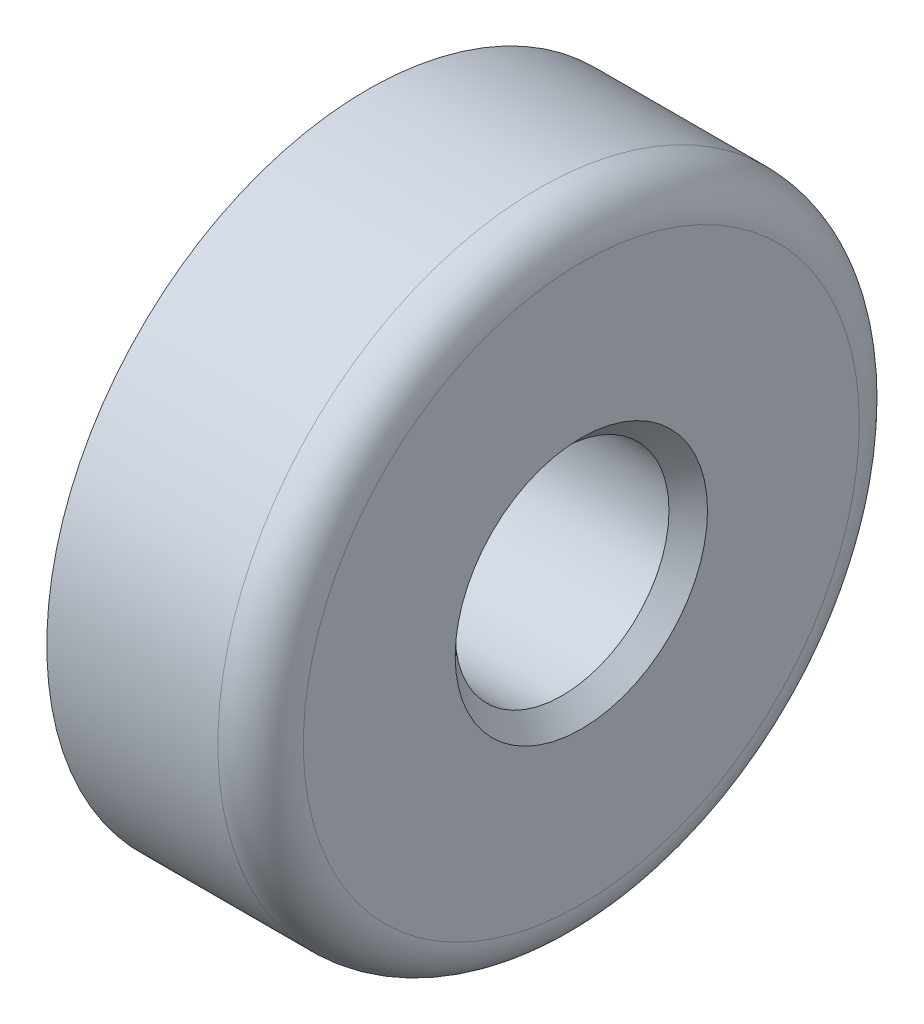
ISO-10303-21;
HEADER;
FILE_DESCRIPTION(('STEP AP214'),'2;1');
FILE_NAME('part.step','',(''),(''),'','','');
FILE_SCHEMA(('AUTOMOTIVE_DESIGN { 1 0 10303 214 1 1 1 1 }'));
ENDSEC;
DATA;
#1=APPLICATION_CONTEXT('core data for automotive mechanical design processes');
#2=APPLICATION_PROTOCOL_DEFINITION('international standard','automotive_design',2000,#1);
#3=PRODUCT_CONTEXT('',#1,'mechanical');
#4=PRODUCT('Part','Part','',(#3));
#5=PRODUCT_RELATED_PRODUCT_CATEGORY('part','',(#4));
#6=PRODUCT_DEFINITION_FORMATION('','',#4);
#7=PRODUCT_DEFINITION_CONTEXT('part definition',#1,'design');
#8=PRODUCT_DEFINITION('design','',#6,#7);
#9=PRODUCT_DEFINITION_SHAPE('','',#8);
#10=(LENGTH_UNIT() NAMED_UNIT(*) SI_UNIT(.MILLI.,.METRE.));
#11=(NAMED_UNIT(*) PLANE_ANGLE_UNIT() SI_UNIT($,.RADIAN.));
#12=(NAMED_UNIT(*) SI_UNIT($,.STERADIAN.) SOLID_ANGLE_UNIT());
#13=UNCERTAINTY_MEASURE_WITH_UNIT(LENGTH_MEASURE(1.E-05),#10,'distance_accuracy_value','');
#14=(GEOMETRIC_REPRESENTATION_CONTEXT(3) GLOBAL_UNCERTAINTY_ASSIGNED_CONTEXT((#13)) GLOBAL_UNIT_ASSIGNED_CONTEXT((#10,
#11,#12)) REPRESENTATION_CONTEXT('',''));
#15=CARTESIAN_POINT('',(0.,0.,0.));
#16=DIRECTION('',(0.,0.,1.));
#17=DIRECTION('',(1.,0.,0.));
#18=AXIS2_PLACEMENT_3D('',#15,#16,#17);
#19=CARTESIAN_POINT('',(5.5,52.5596707782031,134.804015254503));
#20=DIRECTION('',(-1.,0.,0.));
#21=DIRECTION('',(0.,0.,1.));
#22=AXIS2_PLACEMENT_3D('',#19,#20,#21);
#23=CYLINDRICAL_SURFACE('',#22,3.75000000000033);
#24=CARTESIAN_POINT('',(5.,52.5596707782031,134.804015254503));
#25=DIRECTION('',(1.,0.,0.));
#26=DIRECTION('',(0.,0.,-1.));
#27=AXIS2_PLACEMENT_3D('',#24,#25,#26);
#28=CIRCLE('',#27,3.75000000000033);
#29=CARTESIAN_POINT('',(5.,52.5596707782031,131.054015254503));
#30=VERTEX_POINT('',#29);
#31=EDGE_CURVE('E10',#30,#30,#28,.F.);
#32=ORIENTED_EDGE('',*,*,#31,.T.);
#33=EDGE_LOOP('',(#32));
#34=FACE_BOUND('',#33,.T.);
#35=CARTESIAN_POINT('',(3.,52.5596707782031,134.804015254503));
#36=DIRECTION('',(1.,0.,0.));
#37=DIRECTION('',(0.,0.,-1.));
#38=AXIS2_PLACEMENT_3D('',#35,#36,#37);
#39=CIRCLE('',#38,3.75000000000033);
#40=CARTESIAN_POINT('',(3.,52.5596707782031,131.054015254503));
#41=VERTEX_POINT('',#40);
#42=EDGE_CURVE('E59',#41,#41,#39,.T.);
#43=ORIENTED_EDGE('',*,*,#42,.T.);
#44=EDGE_LOOP('',(#43));
#45=FACE_BOUND('',#44,.T.);
#46=ADVANCED_FACE('F33',(#34,#45),#23,.T.);
#47=CARTESIAN_POINT('',(5.5,52.5596707782031,134.804015254503));
#48=DIRECTION('',(1.,0.,0.));
#49=DIRECTION('',(0.,0.,-1.));
#50=AXIS2_PLACEMENT_3D('',#47,#48,#49);
#51=PLANE('',#50);
#52=CARTESIAN_POINT('',(5.5,52.5596707782031,134.804015254503));
#53=DIRECTION('',(1.,0.,0.));
#54=DIRECTION('',(0.,0.,-1.));
#55=AXIS2_PLACEMENT_3D('',#52,#53,#54);
#56=CIRCLE('',#55,3.25000000000033);
#57=CARTESIAN_POINT('',(5.5,52.5596707782031,131.554015254503));
#58=VERTEX_POINT('',#57);
#59=EDGE_CURVE('E40',#58,#58,#56,.T.);
#60=ORIENTED_EDGE('',*,*,#59,.T.);
#61=EDGE_LOOP('',(#60));
#62=FACE_BOUND('',#61,.T.);
#63=CARTESIAN_POINT('',(5.5,52.5596707782031,134.804015254503));
#64=DIRECTION('',(1.,0.,0.));
#65=DIRECTION('',(0.,0.,-1.));
#66=AXIS2_PLACEMENT_3D('',#63,#64,#65);
#67=CIRCLE('',#66,1.475);
#68=CARTESIAN_POINT('',(5.5,52.5596707782031,133.329015254503));
#69=VERTEX_POINT('',#68);
#70=EDGE_CURVE('E56',#69,#69,#67,.F.);
#71=ORIENTED_EDGE('',*,*,#70,.T.);
#72=EDGE_LOOP('',(#71));
#73=FACE_BOUND('',#72,.T.);
#74=ADVANCED_FACE('F67',(#62,#73),#51,.T.);
#75=CARTESIAN_POINT('',(3.,52.5596707782031,134.804015254503));
#76=DIRECTION('',(1.,0.,0.));
#77=DIRECTION('',(0.,0.,-1.));
#78=AXIS2_PLACEMENT_3D('',#75,#76,#77);
#79=PLANE('',#78);
#80=CARTESIAN_POINT('',(3.,52.5596707782031,134.804015254503));
#81=DIRECTION('',(1.,0.,0.));
#82=DIRECTION('',(0.,0.,-1.));
#83=AXIS2_PLACEMENT_3D('',#80,#81,#82);
#84=CIRCLE('',#83,1.47499999999995);
#85=CARTESIAN_POINT('',(3.,52.5596707782031,133.329015254503));
#86=VERTEX_POINT('',#85);
#87=EDGE_CURVE('E44',#86,#86,#84,.T.);
#88=ORIENTED_EDGE('',*,*,#87,.T.);
#89=EDGE_LOOP('',(#88));
#90=FACE_BOUND('',#89,.T.);
#91=ORIENTED_EDGE('',*,*,#42,.F.);
#92=EDGE_LOOP('',(#91));
#93=FACE_BOUND('',#92,.T.);
#94=ADVANCED_FACE('F64',(#90,#93),#79,.F.);
#95=CARTESIAN_POINT('',(3.,52.5596707782031,134.804015254503));
#96=DIRECTION('',(-1.,0.,0.));
#97=DIRECTION('',(0.,0.,1.));
#98=AXIS2_PLACEMENT_3D('',#95,#96,#97);
#99=CYLINDRICAL_SURFACE('',#98,1.24999999999999);
#100=CARTESIAN_POINT('',(5.27499999999999,52.5596707782031,134.804015254503));
#101=DIRECTION('',(1.,0.,0.));
#102=DIRECTION('',(0.,0.,-1.));
#103=AXIS2_PLACEMENT_3D('',#100,#101,#102);
#104=CIRCLE('',#103,1.24999999999999);
#105=CARTESIAN_POINT('',(5.27499999999999,52.5596707782031,133.554015254503));
#106=VERTEX_POINT('',#105);
#107=EDGE_CURVE('E48',#106,#106,#104,.T.);
#108=ORIENTED_EDGE('',*,*,#107,.T.);
#109=EDGE_LOOP('',(#108));
#110=FACE_BOUND('',#109,.T.);
#111=CARTESIAN_POINT('',(3.22499999999997,52.5596707782031,134.804015254503));
#112=DIRECTION('',(1.,0.,0.));
#113=DIRECTION('',(0.,0.,-1.));
#114=AXIS2_PLACEMENT_3D('',#111,#112,#113);
#115=CIRCLE('',#114,1.24999999999999);
#116=CARTESIAN_POINT('',(3.22499999999997,52.5596707782031,133.554015254503));
#117=VERTEX_POINT('',#116);
#118=EDGE_CURVE('E53',#117,#117,#115,.F.);
#119=ORIENTED_EDGE('',*,*,#118,.T.);
#120=EDGE_LOOP('',(#119));
#121=FACE_BOUND('',#120,.T.);
#122=ADVANCED_FACE('F66',(#110,#121),#99,.F.);
#123=CARTESIAN_POINT('',(5.5,52.5596707782031,134.804015254503));
#124=DIRECTION('',(1.,0.,0.));
#125=DIRECTION('',(0.,0.,-1.));
#126=AXIS2_PLACEMENT_3D('',#123,#124,#125);
#127=CONICAL_SURFACE('',#126,1.475,0.785398163397439);
#128=ORIENTED_EDGE('',*,*,#107,.F.);
#129=EDGE_LOOP('',(#128));
#130=FACE_BOUND('',#129,.T.);
#131=ORIENTED_EDGE('',*,*,#70,.F.);
#132=EDGE_LOOP('',(#131));
#133=FACE_BOUND('',#132,.T.);
#134=ADVANCED_FACE('F74',(#130,#133),#127,.F.);
#135=CARTESIAN_POINT('',(3.22499999999997,52.5596707782031,134.804015254503));
#136=DIRECTION('',(-1.,0.,0.));
#137=DIRECTION('',(0.,0.,1.));
#138=AXIS2_PLACEMENT_3D('',#135,#136,#137);
#139=CONICAL_SURFACE('',#138,1.24999999999999,0.785398163397415);
#140=ORIENTED_EDGE('',*,*,#87,.F.);
#141=EDGE_LOOP('',(#140));
#142=FACE_BOUND('',#141,.T.);
#143=ORIENTED_EDGE('',*,*,#118,.F.);
#144=EDGE_LOOP('',(#143));
#145=FACE_BOUND('',#144,.T.);
#146=ADVANCED_FACE('F88',(#142,#145),#139,.F.);
#147=CARTESIAN_POINT('',(5.,52.5596707782031,134.804015254503));
#148=DIRECTION('',(1.,0.,0.));
#149=DIRECTION('',(0.,0.,-1.));
#150=AXIS2_PLACEMENT_3D('',#147,#148,#149);
#151=TOROIDAL_SURFACE('',#150,3.25000000000033,0.5);
#152=ORIENTED_EDGE('',*,*,#31,.F.);
#153=EDGE_LOOP('',(#152));
#154=FACE_BOUND('',#153,.T.);
#155=ORIENTED_EDGE('',*,*,#59,.F.);
#156=EDGE_LOOP('',(#155));
#157=FACE_BOUND('',#156,.T.);
#158=ADVANCED_FACE('F35',(#154,#157),#151,.T.);
#159=CLOSED_SHELL('',(#46,#74,#94,#122,#134,#146,#158));
#160=MANIFOLD_SOLID_BREP('B2',#159);
#161=ADVANCED_BREP_SHAPE_REPRESENTATION('',(#18,#160),#14);
#162=SHAPE_DEFINITION_REPRESENTATION(#9,#161);
ENDSEC;
END-ISO-10303-21;
